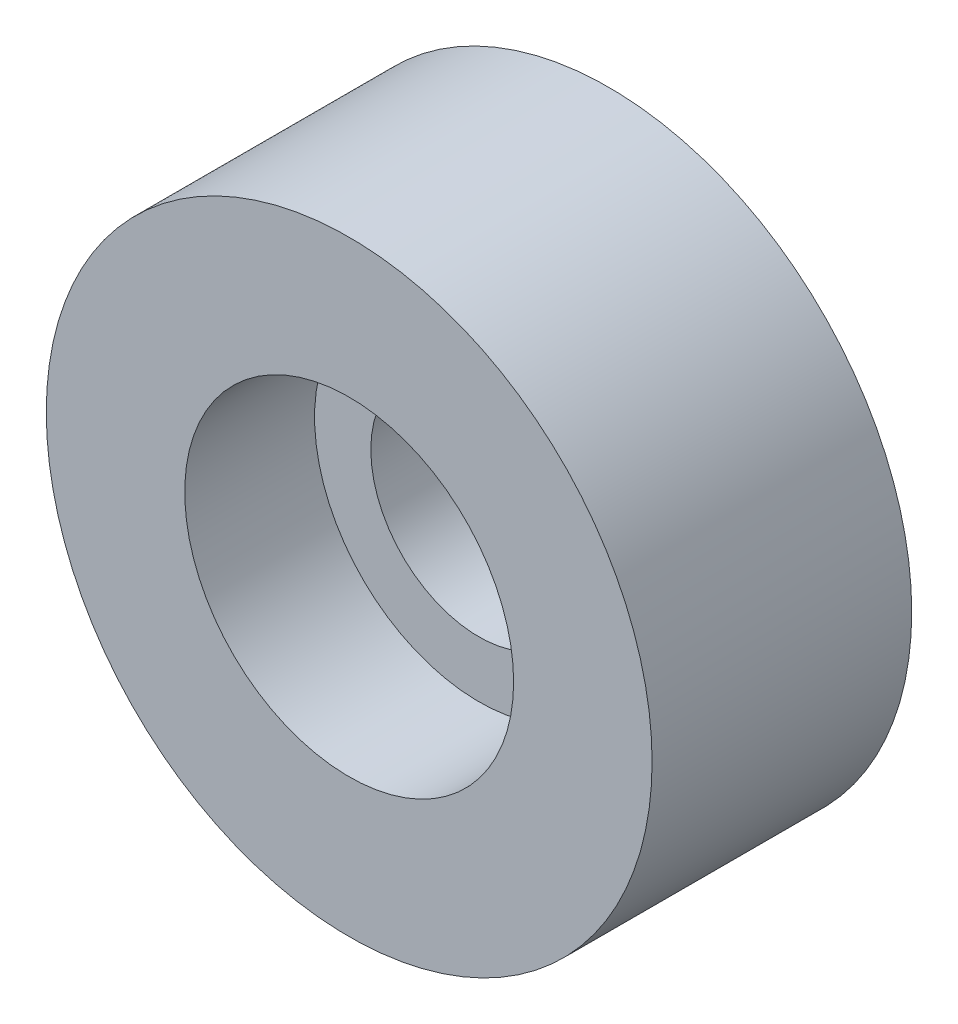
ISO-10303-21;
HEADER;
FILE_DESCRIPTION(('STEP AP214'),'2;1');
FILE_NAME('part.step','',(''),(''),'','','');
FILE_SCHEMA(('AUTOMOTIVE_DESIGN { 1 0 10303 214 1 1 1 1 }'));
ENDSEC;
DATA;
#1=APPLICATION_CONTEXT('core data for automotive mechanical design processes');
#2=APPLICATION_PROTOCOL_DEFINITION('international standard','automotive_design',2000,#1);
#3=PRODUCT_CONTEXT('',#1,'mechanical');
#4=PRODUCT('Part','Part','',(#3));
#5=PRODUCT_RELATED_PRODUCT_CATEGORY('part','',(#4));
#6=PRODUCT_DEFINITION_FORMATION('','',#4);
#7=PRODUCT_DEFINITION_CONTEXT('part definition',#1,'design');
#8=PRODUCT_DEFINITION('design','',#6,#7);
#9=PRODUCT_DEFINITION_SHAPE('','',#8);
#10=(LENGTH_UNIT() NAMED_UNIT(*) SI_UNIT(.MILLI.,.METRE.));
#11=(NAMED_UNIT(*) PLANE_ANGLE_UNIT() SI_UNIT($,.RADIAN.));
#12=(NAMED_UNIT(*) SI_UNIT($,.STERADIAN.) SOLID_ANGLE_UNIT());
#13=UNCERTAINTY_MEASURE_WITH_UNIT(LENGTH_MEASURE(1.E-05),#10,'distance_accuracy_value','');
#14=(GEOMETRIC_REPRESENTATION_CONTEXT(3) GLOBAL_UNCERTAINTY_ASSIGNED_CONTEXT((#13)) GLOBAL_UNIT_ASSIGNED_CONTEXT((#10,
#11,#12)) REPRESENTATION_CONTEXT('',''));
#15=CARTESIAN_POINT('',(0.,0.,0.));
#16=DIRECTION('',(0.,0.,1.));
#17=DIRECTION('',(1.,0.,0.));
#18=AXIS2_PLACEMENT_3D('',#15,#16,#17);
#19=CARTESIAN_POINT('',(0.,0.,0.));
#20=DIRECTION('',(0.,0.,1.));
#21=DIRECTION('',(1.,0.,0.));
#22=AXIS2_PLACEMENT_3D('',#19,#20,#21);
#23=CYLINDRICAL_SURFACE('',#22,1.25);
#24=CARTESIAN_POINT('',(0.,0.,1.5));
#25=DIRECTION('',(0.,0.,1.));
#26=DIRECTION('',(1.,0.,0.));
#27=AXIS2_PLACEMENT_3D('',#24,#25,#26);
#28=CIRCLE('',#27,1.25);
#29=CARTESIAN_POINT('',(1.25,0.,1.5));
#30=VERTEX_POINT('',#29);
#31=EDGE_CURVE('E66',#30,#30,#28,.T.);
#32=ORIENTED_EDGE('',*,*,#31,.T.);
#33=EDGE_LOOP('',(#32));
#34=FACE_BOUND('',#33,.T.);
#35=CARTESIAN_POINT('',(0.,0.,0.));
#36=DIRECTION('',(0.,0.,-1.));
#37=DIRECTION('',(-1.,0.,0.));
#38=AXIS2_PLACEMENT_3D('',#35,#36,#37);
#39=CIRCLE('',#38,1.25);
#40=CARTESIAN_POINT('',(-1.25,0.,0.));
#41=VERTEX_POINT('',#40);
#42=EDGE_CURVE('E10',#41,#41,#39,.F.);
#43=ORIENTED_EDGE('',*,*,#42,.F.);
#44=EDGE_LOOP('',(#43));
#45=FACE_BOUND('',#44,.T.);
#46=ADVANCED_FACE('F37',(#34,#45),#23,.F.);
#47=CARTESIAN_POINT('',(0.,0.,0.));
#48=DIRECTION('',(0.,0.,1.));
#49=DIRECTION('',(1.,0.,0.));
#50=AXIS2_PLACEMENT_3D('',#47,#48,#49);
#51=PLANE('',#50);
#52=CARTESIAN_POINT('',(0.,0.,0.));
#53=DIRECTION('',(0.,0.,1.));
#54=DIRECTION('',(1.,0.,0.));
#55=AXIS2_PLACEMENT_3D('',#52,#53,#54);
#56=CIRCLE('',#55,3.5);
#57=CARTESIAN_POINT('',(3.5,0.,0.));
#58=VERTEX_POINT('',#57);
#59=EDGE_CURVE('E55',#58,#58,#56,.T.);
#60=ORIENTED_EDGE('',*,*,#59,.F.);
#61=EDGE_LOOP('',(#60));
#62=FACE_BOUND('',#61,.T.);
#63=CARTESIAN_POINT('',(0.,0.,0.));
#64=DIRECTION('',(0.,0.,1.));
#65=DIRECTION('',(1.,0.,0.));
#66=AXIS2_PLACEMENT_3D('',#63,#64,#65);
#67=CIRCLE('',#66,2.);
#68=CARTESIAN_POINT('',(2.,0.,0.));
#69=VERTEX_POINT('',#68);
#70=EDGE_CURVE('E45',#69,#69,#67,.F.);
#71=ORIENTED_EDGE('',*,*,#70,.F.);
#72=EDGE_LOOP('',(#71));
#73=FACE_BOUND('',#72,.T.);
#74=ADVANCED_FACE('F107',(#62,#73),#51,.F.);
#75=CARTESIAN_POINT('',(0.,0.,3.));
#76=DIRECTION('',(0.,0.,-1.));
#77=DIRECTION('',(-1.,0.,0.));
#78=AXIS2_PLACEMENT_3D('',#75,#76,#77);
#79=CYLINDRICAL_SURFACE('',#78,3.5);
#80=CARTESIAN_POINT('',(0.,0.,3.));
#81=DIRECTION('',(0.,0.,1.));
#82=DIRECTION('',(1.,0.,0.));
#83=AXIS2_PLACEMENT_3D('',#80,#81,#82);
#84=CIRCLE('',#83,3.5);
#85=CARTESIAN_POINT('',(3.5,0.,3.));
#86=VERTEX_POINT('',#85);
#87=EDGE_CURVE('E50',#86,#86,#84,.T.);
#88=ORIENTED_EDGE('',*,*,#87,.F.);
#89=EDGE_LOOP('',(#88));
#90=FACE_BOUND('',#89,.T.);
#91=ORIENTED_EDGE('',*,*,#59,.T.);
#92=EDGE_LOOP('',(#91));
#93=FACE_BOUND('',#92,.T.);
#94=ADVANCED_FACE('F39',(#90,#93),#79,.T.);
#95=CARTESIAN_POINT('',(0.,0.,3.));
#96=DIRECTION('',(0.,0.,1.));
#97=DIRECTION('',(1.,0.,0.));
#98=AXIS2_PLACEMENT_3D('',#95,#96,#97);
#99=PLANE('',#98);
#100=CARTESIAN_POINT('',(0.,0.,3.));
#101=DIRECTION('',(0.,0.,1.));
#102=DIRECTION('',(1.,0.,0.));
#103=AXIS2_PLACEMENT_3D('',#100,#101,#102);
#104=CIRCLE('',#103,1.9);
#105=CARTESIAN_POINT('',(1.9,0.,3.));
#106=VERTEX_POINT('',#105);
#107=EDGE_CURVE('E62',#106,#106,#104,.T.);
#108=ORIENTED_EDGE('',*,*,#107,.F.);
#109=EDGE_LOOP('',(#108));
#110=FACE_BOUND('',#109,.T.);
#111=ORIENTED_EDGE('',*,*,#87,.T.);
#112=EDGE_LOOP('',(#111));
#113=FACE_BOUND('',#112,.T.);
#114=ADVANCED_FACE('F118',(#110,#113),#99,.T.);
#115=CARTESIAN_POINT('',(0.,0.,1.5));
#116=DIRECTION('',(0.,0.,1.));
#117=DIRECTION('',(1.,0.,0.));
#118=AXIS2_PLACEMENT_3D('',#115,#116,#117);
#119=CYLINDRICAL_SURFACE('',#118,1.9);
#120=CARTESIAN_POINT('',(0.,0.,1.5));
#121=DIRECTION('',(0.,0.,1.));
#122=DIRECTION('',(1.,0.,0.));
#123=AXIS2_PLACEMENT_3D('',#120,#121,#122);
#124=CIRCLE('',#123,1.9);
#125=CARTESIAN_POINT('',(1.9,0.,1.5));
#126=VERTEX_POINT('',#125);
#127=EDGE_CURVE('E60',#126,#126,#124,.T.);
#128=ORIENTED_EDGE('',*,*,#127,.F.);
#129=EDGE_LOOP('',(#128));
#130=FACE_BOUND('',#129,.T.);
#131=ORIENTED_EDGE('',*,*,#107,.T.);
#132=EDGE_LOOP('',(#131));
#133=FACE_BOUND('',#132,.T.);
#134=ADVANCED_FACE('F102',(#130,#133),#119,.F.);
#135=CARTESIAN_POINT('',(0.,0.,1.5));
#136=DIRECTION('',(0.,0.,1.));
#137=DIRECTION('',(1.,0.,0.));
#138=AXIS2_PLACEMENT_3D('',#135,#136,#137);
#139=PLANE('',#138);
#140=ORIENTED_EDGE('',*,*,#31,.F.);
#141=EDGE_LOOP('',(#140));
#142=FACE_BOUND('',#141,.T.);
#143=ORIENTED_EDGE('',*,*,#127,.T.);
#144=EDGE_LOOP('',(#143));
#145=FACE_BOUND('',#144,.T.);
#146=ADVANCED_FACE('F92',(#142,#145),#139,.T.);
#147=CARTESIAN_POINT('',(0.,0.,-1.));
#148=DIRECTION('',(0.,0.,-1.));
#149=DIRECTION('',(-1.,0.,0.));
#150=AXIS2_PLACEMENT_3D('',#147,#148,#149);
#151=PLANE('',#150);
#152=CARTESIAN_POINT('',(0.,0.,-1.));
#153=DIRECTION('',(0.,0.,-1.));
#154=DIRECTION('',(-1.,0.,0.));
#155=AXIS2_PLACEMENT_3D('',#152,#153,#154);
#156=CIRCLE('',#155,2.);
#157=CARTESIAN_POINT('',(-2.,0.,-1.));
#158=VERTEX_POINT('',#157);
#159=EDGE_CURVE('E73',#158,#158,#156,.T.);
#160=ORIENTED_EDGE('',*,*,#159,.T.);
#161=EDGE_LOOP('',(#160));
#162=FACE_BOUND('',#161,.T.);
#163=CARTESIAN_POINT('',(0.,0.,-1.));
#164=DIRECTION('',(0.,0.,-1.));
#165=DIRECTION('',(-1.,0.,0.));
#166=AXIS2_PLACEMENT_3D('',#163,#164,#165);
#167=CIRCLE('',#166,1.05);
#168=CARTESIAN_POINT('',(-1.05,0.,-1.));
#169=VERTEX_POINT('',#168);
#170=EDGE_CURVE('E77',#169,#169,#167,.T.);
#171=ORIENTED_EDGE('',*,*,#170,.F.);
#172=EDGE_LOOP('',(#171));
#173=FACE_BOUND('',#172,.T.);
#174=ADVANCED_FACE('F89',(#162,#173),#151,.T.);
#175=CARTESIAN_POINT('',(0.,0.,-1.));
#176=DIRECTION('',(0.,0.,1.));
#177=DIRECTION('',(1.,0.,0.));
#178=AXIS2_PLACEMENT_3D('',#175,#176,#177);
#179=CYLINDRICAL_SURFACE('',#178,2.);
#180=ORIENTED_EDGE('',*,*,#159,.F.);
#181=EDGE_LOOP('',(#180));
#182=FACE_BOUND('',#181,.T.);
#183=ORIENTED_EDGE('',*,*,#70,.T.);
#184=EDGE_LOOP('',(#183));
#185=FACE_BOUND('',#184,.T.);
#186=ADVANCED_FACE('F91',(#182,#185),#179,.T.);
#187=CARTESIAN_POINT('',(0.,0.,0.));
#188=DIRECTION('',(0.,0.,-1.));
#189=DIRECTION('',(-1.,0.,0.));
#190=AXIS2_PLACEMENT_3D('',#187,#188,#189);
#191=PLANE('',#190);
#192=ORIENTED_EDGE('',*,*,#42,.T.);
#193=EDGE_LOOP('',(#192));
#194=FACE_BOUND('',#193,.T.);
#195=CARTESIAN_POINT('',(0.,0.,0.));
#196=DIRECTION('',(0.,0.,-1.));
#197=DIRECTION('',(-1.,0.,0.));
#198=AXIS2_PLACEMENT_3D('',#195,#196,#197);
#199=CIRCLE('',#198,1.05);
#200=CARTESIAN_POINT('',(-1.05,0.,0.));
#201=VERTEX_POINT('',#200);
#202=EDGE_CURVE('E78',#201,#201,#199,.T.);
#203=ORIENTED_EDGE('',*,*,#202,.T.);
#204=EDGE_LOOP('',(#203));
#205=FACE_BOUND('',#204,.T.);
#206=ADVANCED_FACE('F99',(#194,#205),#191,.F.);
#207=CARTESIAN_POINT('',(0.,0.,-1.));
#208=DIRECTION('',(0.,0.,1.));
#209=DIRECTION('',(1.,0.,0.));
#210=AXIS2_PLACEMENT_3D('',#207,#208,#209);
#211=CYLINDRICAL_SURFACE('',#210,1.05);
#212=ORIENTED_EDGE('',*,*,#170,.T.);
#213=EDGE_LOOP('',(#212));
#214=FACE_BOUND('',#213,.T.);
#215=ORIENTED_EDGE('',*,*,#202,.F.);
#216=EDGE_LOOP('',(#215));
#217=FACE_BOUND('',#216,.T.);
#218=ADVANCED_FACE('F86',(#214,#217),#211,.F.);
#219=CLOSED_SHELL('',(#46,#74,#94,#114,#134,#146,#174,#186,#206,#218));
#220=MANIFOLD_SOLID_BREP('B2',#219);
#221=ADVANCED_BREP_SHAPE_REPRESENTATION('',(#18,#220),#14);
#222=SHAPE_DEFINITION_REPRESENTATION(#9,#221);
ENDSEC;
END-ISO-10303-21;
